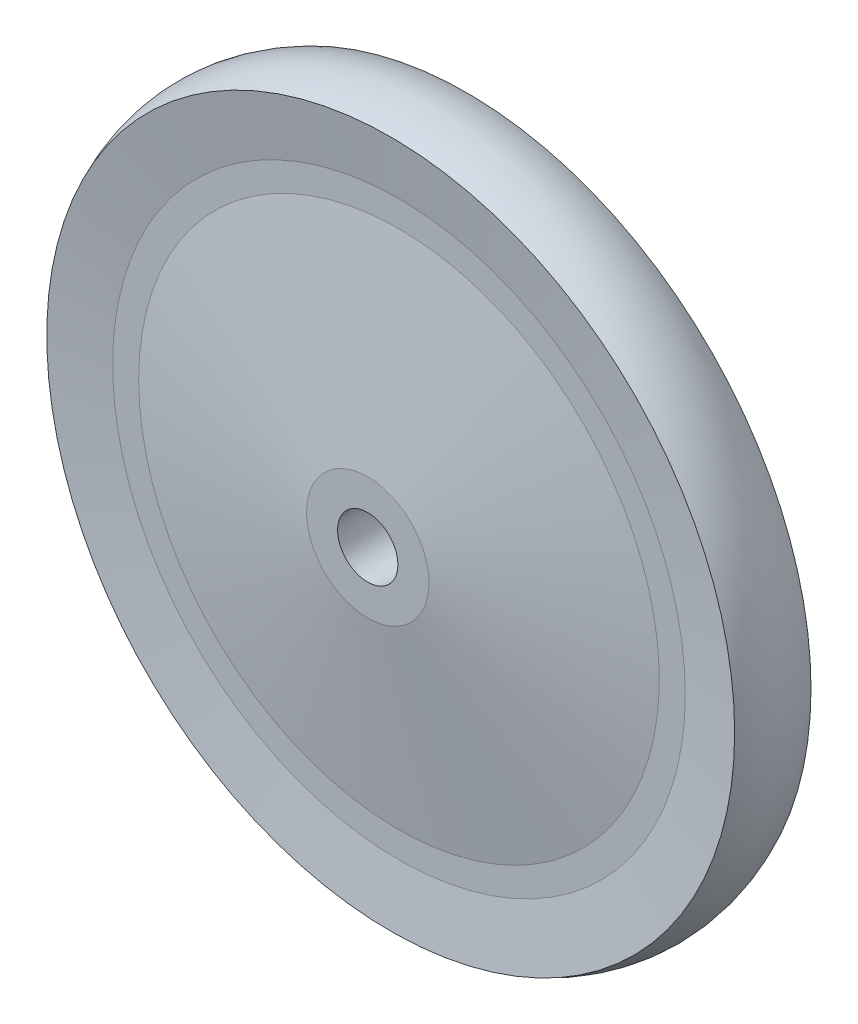
ISO-10303-21;
HEADER;
FILE_DESCRIPTION(('STEP AP214'),'2;1');
FILE_NAME('part.step','',(''),(''),'','','');
FILE_SCHEMA(('AUTOMOTIVE_DESIGN { 1 0 10303 214 1 1 1 1 }'));
ENDSEC;
DATA;
#1=APPLICATION_CONTEXT('core data for automotive mechanical design processes');
#2=APPLICATION_PROTOCOL_DEFINITION('international standard','automotive_design',2000,#1);
#3=PRODUCT_CONTEXT('',#1,'mechanical');
#4=PRODUCT('Part','Part','',(#3));
#5=PRODUCT_RELATED_PRODUCT_CATEGORY('part','',(#4));
#6=PRODUCT_DEFINITION_FORMATION('','',#4);
#7=PRODUCT_DEFINITION_CONTEXT('part definition',#1,'design');
#8=PRODUCT_DEFINITION('design','',#6,#7);
#9=PRODUCT_DEFINITION_SHAPE('','',#8);
#10=(LENGTH_UNIT() NAMED_UNIT(*) SI_UNIT(.MILLI.,.METRE.));
#11=(NAMED_UNIT(*) PLANE_ANGLE_UNIT() SI_UNIT($,.RADIAN.));
#12=(NAMED_UNIT(*) SI_UNIT($,.STERADIAN.) SOLID_ANGLE_UNIT());
#13=UNCERTAINTY_MEASURE_WITH_UNIT(LENGTH_MEASURE(1.E-05),#10,'distance_accuracy_value','');
#14=(GEOMETRIC_REPRESENTATION_CONTEXT(3) GLOBAL_UNCERTAINTY_ASSIGNED_CONTEXT((#13)) GLOBAL_UNIT_ASSIGNED_CONTEXT((#10,
#11,#12)) REPRESENTATION_CONTEXT('',''));
#15=CARTESIAN_POINT('',(0.,0.,0.));
#16=DIRECTION('',(0.,0.,1.));
#17=DIRECTION('',(1.,0.,0.));
#18=AXIS2_PLACEMENT_3D('',#15,#16,#17);
#19=CARTESIAN_POINT('',(0.,35.25,-35.25));
#20=DIRECTION('',(0.,0.,1.));
#21=DIRECTION('',(1.,0.,0.));
#22=AXIS2_PLACEMENT_3D('',#19,#20,#21);
#23=PLANE('',#22);
#24=CARTESIAN_POINT('',(0.,0.,-35.25));
#25=DIRECTION('',(0.,0.,1.));
#26=DIRECTION('',(1.,0.,0.));
#27=AXIS2_PLACEMENT_3D('',#24,#25,#26);
#28=CIRCLE('',#27,35.25);
#29=CARTESIAN_POINT('',(35.25,0.,-35.25));
#30=VERTEX_POINT('',#29);
#31=EDGE_CURVE('E10',#30,#30,#28,.T.);
#32=ORIENTED_EDGE('',*,*,#31,.F.);
#33=EDGE_LOOP('',(#32));
#34=FACE_BOUND('',#33,.T.);
#35=CARTESIAN_POINT('',(0.,0.,-35.25));
#36=DIRECTION('',(0.,0.,1.));
#37=DIRECTION('',(1.,0.,0.));
#38=AXIS2_PLACEMENT_3D('',#35,#36,#37);
#39=CIRCLE('',#38,17.375);
#40=CARTESIAN_POINT('',(17.375,0.,-35.25));
#41=VERTEX_POINT('',#40);
#42=EDGE_CURVE('E68',#41,#41,#39,.T.);
#43=ORIENTED_EDGE('',*,*,#42,.T.);
#44=EDGE_LOOP('',(#43));
#45=FACE_BOUND('',#44,.T.);
#46=ADVANCED_FACE('F34',(#34,#45),#23,.F.);
#47=CARTESIAN_POINT('',(0.,0.,-35.25));
#48=DIRECTION('',(0.,0.,1.));
#49=DIRECTION('',(1.,0.,0.));
#50=AXIS2_PLACEMENT_3D('',#47,#48,#49);
#51=CONICAL_SURFACE('',#50,35.25,1.41520149881787);
#52=CARTESIAN_POINT('',(0.,0.,-17.25));
#53=DIRECTION('',(0.,0.,1.));
#54=DIRECTION('',(1.,0.,0.));
#55=AXIS2_PLACEMENT_3D('',#52,#53,#54);
#56=CIRCLE('',#55,150.);
#57=CARTESIAN_POINT('',(150.,0.,-17.25));
#58=VERTEX_POINT('',#57);
#59=EDGE_CURVE('E40',#58,#58,#56,.T.);
#60=CARTESIAN_POINT('',(150.,0.,-17.25));
#61=CARTESIAN_POINT('',(148.8046875,0.,-17.4375));
#62=CARTESIAN_POINT('',(147.609375,0.,-17.625));
#63=CARTESIAN_POINT('',(145.21875,0.,-18.));
#64=CARTESIAN_POINT('',(144.0234375,0.,-18.1875));
#65=CARTESIAN_POINT('',(141.6328125,0.,-18.5625));
#66=CARTESIAN_POINT('',(140.4375,0.,-18.75));
#67=CARTESIAN_POINT('',(138.046875,0.,-19.125));
#68=CARTESIAN_POINT('',(136.8515625,0.,-19.3125));
#69=CARTESIAN_POINT('',(134.4609375,0.,-19.6875));
#70=CARTESIAN_POINT('',(133.265625,0.,-19.875));
#71=CARTESIAN_POINT('',(130.875,0.,-20.25));
#72=CARTESIAN_POINT('',(129.6796875,0.,-20.4375));
#73=CARTESIAN_POINT('',(127.2890625,0.,-20.8125));
#74=CARTESIAN_POINT('',(126.09375,0.,-21.));
#75=CARTESIAN_POINT('',(123.703125,0.,-21.375));
#76=CARTESIAN_POINT('',(122.5078125,0.,-21.5625));
#77=CARTESIAN_POINT('',(120.1171875,0.,-21.9375));
#78=CARTESIAN_POINT('',(118.921875,0.,-22.125));
#79=CARTESIAN_POINT('',(116.53125,0.,-22.5));
#80=CARTESIAN_POINT('',(115.3359375,0.,-22.6875));
#81=CARTESIAN_POINT('',(112.9453125,0.,-23.0625));
#82=CARTESIAN_POINT('',(111.75,0.,-23.25));
#83=CARTESIAN_POINT('',(109.359375,0.,-23.625));
#84=CARTESIAN_POINT('',(108.1640625,0.,-23.8125));
#85=CARTESIAN_POINT('',(105.7734375,0.,-24.1875));
#86=CARTESIAN_POINT('',(104.578125,0.,-24.375));
#87=CARTESIAN_POINT('',(102.1875,0.,-24.75));
#88=CARTESIAN_POINT('',(100.9921875,0.,-24.9375));
#89=CARTESIAN_POINT('',(98.6015625,0.,-25.3125));
#90=CARTESIAN_POINT('',(97.40625,0.,-25.5));
#91=CARTESIAN_POINT('',(95.015625,0.,-25.875));
#92=CARTESIAN_POINT('',(93.8203125,0.,-26.0625));
#93=CARTESIAN_POINT('',(91.4296875,0.,-26.4375));
#94=CARTESIAN_POINT('',(90.234375,0.,-26.625));
#95=CARTESIAN_POINT('',(87.84375,0.,-27.));
#96=CARTESIAN_POINT('',(86.6484375,0.,-27.1875));
#97=CARTESIAN_POINT('',(84.2578125,0.,-27.5625));
#98=CARTESIAN_POINT('',(83.0625,0.,-27.75));
#99=CARTESIAN_POINT('',(80.671875,0.,-28.125));
#100=CARTESIAN_POINT('',(79.4765625,0.,-28.3125));
#101=CARTESIAN_POINT('',(77.0859375,0.,-28.6875));
#102=CARTESIAN_POINT('',(75.890625,0.,-28.875));
#103=CARTESIAN_POINT('',(73.5,0.,-29.25));
#104=CARTESIAN_POINT('',(72.3046875,0.,-29.4375));
#105=CARTESIAN_POINT('',(69.9140625,0.,-29.8125));
#106=CARTESIAN_POINT('',(68.71875,0.,-30.));
#107=CARTESIAN_POINT('',(66.328125,0.,-30.375));
#108=CARTESIAN_POINT('',(65.1328125,0.,-30.5625));
#109=CARTESIAN_POINT('',(62.7421875,0.,-30.9375));
#110=CARTESIAN_POINT('',(61.546875,0.,-31.125));
#111=CARTESIAN_POINT('',(59.15625,0.,-31.5));
#112=CARTESIAN_POINT('',(57.9609375,0.,-31.6875));
#113=CARTESIAN_POINT('',(55.5703125,0.,-32.0625));
#114=CARTESIAN_POINT('',(54.375,0.,-32.25));
#115=CARTESIAN_POINT('',(51.984375,0.,-32.625));
#116=CARTESIAN_POINT('',(50.7890625,0.,-32.8125));
#117=CARTESIAN_POINT('',(48.3984375,0.,-33.1875));
#118=CARTESIAN_POINT('',(47.203125,0.,-33.375));
#119=CARTESIAN_POINT('',(44.8125,0.,-33.75));
#120=CARTESIAN_POINT('',(43.6171875,0.,-33.9375));
#121=CARTESIAN_POINT('',(41.2265625,0.,-34.3125));
#122=CARTESIAN_POINT('',(40.03125,0.,-34.5));
#123=CARTESIAN_POINT('',(37.640625,0.,-34.875));
#124=CARTESIAN_POINT('',(36.4453125,0.,-35.0625));
#125=CARTESIAN_POINT('',(35.25,0.,-35.25));
#126=B_SPLINE_CURVE_WITH_KNOTS('',3,(#60,#61,#62,#63,#64,#65,#66,#67,#68,#69,#70,#71,#72,#73,
#74,#75,#76,#77,#78,#79,#80,#81,#82,#83,#84,#85,#86,#87,#88,#89,#90,#91,#92,#93,#94,#95,#96,#97,
#98,#99,#100,#101,#102,#103,#104,#105,#106,#107,#108,#109,#110,#111,#112,#113,#114,#115,#116,
#117,#118,#119,#120,#121,#122,#123,#124,#125),.UNSPECIFIED.,.F.,.F.,(4,2,2,2,2,2,2,2,2,2,2,2,2,
2,2,2,2,2,2,2,2,2,2,2,2,2,2,2,2,2,2,2,4),(0.,3.62978704663321,7.25957409326644,10.8893611398997,
14.5191481865329,18.148935233166,21.7787222797993,25.4085093264325,29.0382963730657,
32.6680834196989,36.2978704663321,39.9276575129653,43.5574445595985,47.1872316062318,
50.817018652865,54.4468056994982,58.0765927461314,61.7063797927646,65.3361668393978,
68.965953886031,72.5957409326642,76.2255279792975,79.8553150259307,83.4851020725639,
87.1148891191971,90.7446761658303,94.3744632124635,98.0042502590967,101.63403730573,
105.263824352363,108.893611398996,112.52339844563,116.153185492263),.UNSPECIFIED.);
#127=EDGE_CURVE('BSEAM117',#58,#30,#126,.T.);
#128=ORIENTED_EDGE('',*,*,#59,.F.);
#129=ORIENTED_EDGE('',*,*,#31,.T.);
#130=ORIENTED_EDGE('',*,*,#127,.T.);
#131=ORIENTED_EDGE('',*,*,#127,.F.);
#132=EDGE_LOOP('',(#128,#130,#129,#131));
#133=FACE_BOUND('',#132,.T.);
#134=ADVANCED_FACE('F117',(#133),#51,.T.);
#135=CARTESIAN_POINT('',(0.,150.,-17.25));
#136=DIRECTION('',(0.,0.,1.));
#137=DIRECTION('',(1.,0.,0.));
#138=AXIS2_PLACEMENT_3D('',#135,#136,#137);
#139=PLANE('',#138);
#140=CARTESIAN_POINT('',(0.,0.,-17.25));
#141=DIRECTION('',(0.,0.,1.));
#142=DIRECTION('',(1.,0.,0.));
#143=AXIS2_PLACEMENT_3D('',#140,#141,#142);
#144=CIRCLE('',#143,165.);
#145=CARTESIAN_POINT('',(165.,0.,-17.25));
#146=VERTEX_POINT('',#145);
#147=EDGE_CURVE('E44',#146,#146,#144,.T.);
#148=ORIENTED_EDGE('',*,*,#147,.F.);
#149=EDGE_LOOP('',(#148));
#150=FACE_BOUND('',#149,.T.);
#151=ORIENTED_EDGE('',*,*,#59,.T.);
#152=EDGE_LOOP('',(#151));
#153=FACE_BOUND('',#152,.T.);
#154=ADVANCED_FACE('F112',(#150,#153),#139,.F.);
#155=CARTESIAN_POINT('',(0.,0.,-17.25));
#156=DIRECTION('',(0.,0.,-1.));
#157=DIRECTION('',(-1.,0.,0.));
#158=AXIS2_PLACEMENT_3D('',#155,#156,#157);
#159=CONICAL_SURFACE('',#158,165.,1.42868843517088);
#160=CARTESIAN_POINT('',(0.,0.,-22.));
#161=DIRECTION('',(0.,0.,1.));
#162=DIRECTION('',(1.,0.,0.));
#163=AXIS2_PLACEMENT_3D('',#160,#161,#162);
#164=CIRCLE('',#163,198.2);
#165=CARTESIAN_POINT('',(198.2,0.,-22.));
#166=VERTEX_POINT('',#165);
#167=EDGE_CURVE('E48',#166,#166,#164,.T.);
#168=ORIENTED_EDGE('',*,*,#167,.F.);
#169=EDGE_LOOP('',(#168));
#170=FACE_BOUND('',#169,.T.);
#171=ORIENTED_EDGE('',*,*,#147,.T.);
#172=EDGE_LOOP('',(#171));
#173=FACE_BOUND('',#172,.T.);
#174=ADVANCED_FACE('F106',(#170,#173),#159,.F.);
#175=CARTESIAN_POINT('',(0.,0.,0.));
#176=DIRECTION('',(0.,0.,1.));
#177=DIRECTION('',(1.,0.,0.));
#178=AXIS2_PLACEMENT_3D('',#175,#176,#177);
#179=TOROIDAL_SURFACE('',#178,152.3,50.8999999999999);
#180=CARTESIAN_POINT('',(0.,0.,22.));
#181=DIRECTION('',(0.,0.,1.));
#182=DIRECTION('',(1.,0.,0.));
#183=AXIS2_PLACEMENT_3D('',#180,#181,#182);
#184=CIRCLE('',#183,198.2);
#185=CARTESIAN_POINT('',(198.2,0.,22.));
#186=VERTEX_POINT('',#185);
#187=EDGE_CURVE('E53',#186,#186,#184,.T.);
#188=ORIENTED_EDGE('',*,*,#187,.F.);
#189=EDGE_LOOP('',(#188));
#190=FACE_BOUND('',#189,.T.);
#191=ORIENTED_EDGE('',*,*,#167,.T.);
#192=EDGE_LOOP('',(#191));
#193=FACE_BOUND('',#192,.T.);
#194=ADVANCED_FACE('F100',(#190,#193),#179,.T.);
#195=CARTESIAN_POINT('',(0.,0.,22.));
#196=DIRECTION('',(0.,0.,1.));
#197=DIRECTION('',(1.,0.,0.));
#198=AXIS2_PLACEMENT_3D('',#195,#196,#197);
#199=CONICAL_SURFACE('',#198,198.2,1.42868843517088);
#200=CARTESIAN_POINT('',(0.,0.,17.25));
#201=DIRECTION('',(0.,0.,1.));
#202=DIRECTION('',(1.,0.,0.));
#203=AXIS2_PLACEMENT_3D('',#200,#201,#202);
#204=CIRCLE('',#203,165.);
#205=CARTESIAN_POINT('',(165.,0.,17.25));
#206=VERTEX_POINT('',#205);
#207=EDGE_CURVE('E56',#206,#206,#204,.T.);
#208=ORIENTED_EDGE('',*,*,#207,.F.);
#209=EDGE_LOOP('',(#208));
#210=FACE_BOUND('',#209,.T.);
#211=ORIENTED_EDGE('',*,*,#187,.T.);
#212=EDGE_LOOP('',(#211));
#213=FACE_BOUND('',#212,.T.);
#214=ADVANCED_FACE('F94',(#210,#213),#199,.F.);
#215=CARTESIAN_POINT('',(0.,150.,17.25));
#216=DIRECTION('',(0.,0.,-1.));
#217=DIRECTION('',(-1.,0.,0.));
#218=AXIS2_PLACEMENT_3D('',#215,#216,#217);
#219=PLANE('',#218);
#220=CARTESIAN_POINT('',(0.,0.,17.25));
#221=DIRECTION('',(0.,0.,1.));
#222=DIRECTION('',(1.,0.,0.));
#223=AXIS2_PLACEMENT_3D('',#220,#221,#222);
#224=CIRCLE('',#223,150.);
#225=CARTESIAN_POINT('',(-150.,0.,17.25));
#226=VERTEX_POINT('',#225);
#227=EDGE_CURVE('E59',#226,#226,#224,.T.);
#228=ORIENTED_EDGE('',*,*,#227,.F.);
#229=EDGE_LOOP('',(#228));
#230=FACE_BOUND('',#229,.T.);
#231=ORIENTED_EDGE('',*,*,#207,.T.);
#232=EDGE_LOOP('',(#231));
#233=FACE_BOUND('',#232,.T.);
#234=ADVANCED_FACE('F88',(#230,#233),#219,.F.);
#235=CARTESIAN_POINT('',(0.,0.,17.25));
#236=DIRECTION('',(0.,0.,-1.));
#237=DIRECTION('',(-1.,0.,0.));
#238=AXIS2_PLACEMENT_3D('',#235,#236,#237);
#239=CONICAL_SURFACE('',#238,150.,1.41520149881787);
#240=CARTESIAN_POINT('',(0.,0.,35.25));
#241=DIRECTION('',(0.,0.,1.));
#242=DIRECTION('',(1.,0.,0.));
#243=AXIS2_PLACEMENT_3D('',#240,#241,#242);
#244=CIRCLE('',#243,35.25);
#245=CARTESIAN_POINT('',(-35.25,0.,35.25));
#246=VERTEX_POINT('',#245);
#247=EDGE_CURVE('E62',#246,#246,#244,.T.);
#248=CARTESIAN_POINT('',(-35.25,0.,35.25));
#249=CARTESIAN_POINT('',(-36.4453125,0.,35.0625));
#250=CARTESIAN_POINT('',(-37.640625,0.,34.875));
#251=CARTESIAN_POINT('',(-40.03125,0.,34.5));
#252=CARTESIAN_POINT('',(-41.2265625,0.,34.3125));
#253=CARTESIAN_POINT('',(-43.6171875,0.,33.9375));
#254=CARTESIAN_POINT('',(-44.8125,0.,33.75));
#255=CARTESIAN_POINT('',(-47.203125,0.,33.375));
#256=CARTESIAN_POINT('',(-48.3984375,0.,33.1875));
#257=CARTESIAN_POINT('',(-50.7890625,0.,32.8125));
#258=CARTESIAN_POINT('',(-51.984375,0.,32.625));
#259=CARTESIAN_POINT('',(-54.375,0.,32.25));
#260=CARTESIAN_POINT('',(-55.5703125,0.,32.0625));
#261=CARTESIAN_POINT('',(-57.9609375,0.,31.6875));
#262=CARTESIAN_POINT('',(-59.15625,0.,31.5));
#263=CARTESIAN_POINT('',(-61.546875,0.,31.125));
#264=CARTESIAN_POINT('',(-62.7421875,0.,30.9375));
#265=CARTESIAN_POINT('',(-65.1328125,0.,30.5625));
#266=CARTESIAN_POINT('',(-66.328125,0.,30.375));
#267=CARTESIAN_POINT('',(-68.71875,0.,30.));
#268=CARTESIAN_POINT('',(-69.9140625,0.,29.8125));
#269=CARTESIAN_POINT('',(-72.3046875,0.,29.4375));
#270=CARTESIAN_POINT('',(-73.5,0.,29.25));
#271=CARTESIAN_POINT('',(-75.890625,0.,28.875));
#272=CARTESIAN_POINT('',(-77.0859375,0.,28.6875));
#273=CARTESIAN_POINT('',(-79.4765625,0.,28.3125));
#274=CARTESIAN_POINT('',(-80.671875,0.,28.125));
#275=CARTESIAN_POINT('',(-83.0625,0.,27.75));
#276=CARTESIAN_POINT('',(-84.2578125,0.,27.5625));
#277=CARTESIAN_POINT('',(-86.6484375,0.,27.1875));
#278=CARTESIAN_POINT('',(-87.84375,0.,27.));
#279=CARTESIAN_POINT('',(-90.234375,0.,26.625));
#280=CARTESIAN_POINT('',(-91.4296875,0.,26.4375));
#281=CARTESIAN_POINT('',(-93.8203125,0.,26.0625));
#282=CARTESIAN_POINT('',(-95.015625,0.,25.875));
#283=CARTESIAN_POINT('',(-97.40625,0.,25.5));
#284=CARTESIAN_POINT('',(-98.6015625,0.,25.3125));
#285=CARTESIAN_POINT('',(-100.9921875,0.,24.9375));
#286=CARTESIAN_POINT('',(-102.1875,0.,24.75));
#287=CARTESIAN_POINT('',(-104.578125,0.,24.375));
#288=CARTESIAN_POINT('',(-105.7734375,0.,24.1875));
#289=CARTESIAN_POINT('',(-108.1640625,0.,23.8125));
#290=CARTESIAN_POINT('',(-109.359375,0.,23.625));
#291=CARTESIAN_POINT('',(-111.75,0.,23.25));
#292=CARTESIAN_POINT('',(-112.9453125,0.,23.0625));
#293=CARTESIAN_POINT('',(-115.3359375,0.,22.6875));
#294=CARTESIAN_POINT('',(-116.53125,0.,22.5));
#295=CARTESIAN_POINT('',(-118.921875,0.,22.125));
#296=CARTESIAN_POINT('',(-120.1171875,0.,21.9375));
#297=CARTESIAN_POINT('',(-122.5078125,0.,21.5625));
#298=CARTESIAN_POINT('',(-123.703125,0.,21.375));
#299=CARTESIAN_POINT('',(-126.09375,0.,21.));
#300=CARTESIAN_POINT('',(-127.2890625,0.,20.8125));
#301=CARTESIAN_POINT('',(-129.6796875,0.,20.4375));
#302=CARTESIAN_POINT('',(-130.875,0.,20.25));
#303=CARTESIAN_POINT('',(-133.265625,0.,19.875));
#304=CARTESIAN_POINT('',(-134.4609375,0.,19.6875));
#305=CARTESIAN_POINT('',(-136.8515625,0.,19.3125));
#306=CARTESIAN_POINT('',(-138.046875,0.,19.125));
#307=CARTESIAN_POINT('',(-140.4375,0.,18.75));
#308=CARTESIAN_POINT('',(-141.6328125,0.,18.5625));
#309=CARTESIAN_POINT('',(-144.0234375,0.,18.1875));
#310=CARTESIAN_POINT('',(-145.21875,0.,18.));
#311=CARTESIAN_POINT('',(-147.609375,0.,17.625));
#312=CARTESIAN_POINT('',(-148.8046875,0.,17.4375));
#313=CARTESIAN_POINT('',(-150.,0.,17.25));
#314=B_SPLINE_CURVE_WITH_KNOTS('',3,(#248,#249,#250,#251,#252,#253,#254,#255,#256,#257,#258,
#259,#260,#261,#262,#263,#264,#265,#266,#267,#268,#269,#270,#271,#272,#273,#274,#275,#276,#277,
#278,#279,#280,#281,#282,#283,#284,#285,#286,#287,#288,#289,#290,#291,#292,#293,#294,#295,#296,
#297,#298,#299,#300,#301,#302,#303,#304,#305,#306,#307,#308,#309,#310,#311,#312,#313),
.UNSPECIFIED.,.F.,.F.,(4,2,2,2,2,2,2,2,2,2,2,2,2,2,2,2,2,2,2,2,2,2,2,2,2,2,2,2,2,2,2,2,4),(0.,
3.62978704663322,7.25957409326643,10.8893611398996,14.5191481865328,18.1489352331661,
21.7787222797993,25.4085093264325,29.0382963730657,32.6680834196989,36.2978704663321,
39.9276575129653,43.5574445595985,47.1872316062317,50.8170186528649,54.4468056994982,
58.0765927461314,61.7063797927646,65.3361668393978,68.965953886031,72.5957409326642,
76.2255279792974,79.8553150259306,83.4851020725638,87.114889119197,90.7446761658303,
94.3744632124635,98.0042502590967,101.63403730573,105.263824352363,108.893611398996,
112.52339844563,116.153185492263),.UNSPECIFIED.);
#315=EDGE_CURVE('BSEAM82',#246,#226,#314,.T.);
#316=ORIENTED_EDGE('',*,*,#247,.F.);
#317=ORIENTED_EDGE('',*,*,#227,.T.);
#318=ORIENTED_EDGE('',*,*,#315,.T.);
#319=ORIENTED_EDGE('',*,*,#315,.F.);
#320=EDGE_LOOP('',(#316,#318,#317,#319));
#321=FACE_BOUND('',#320,.T.);
#322=ADVANCED_FACE('F82',(#321),#239,.T.);
#323=CARTESIAN_POINT('',(0.,35.25,35.25));
#324=DIRECTION('',(0.,0.,-1.));
#325=DIRECTION('',(-1.,0.,0.));
#326=AXIS2_PLACEMENT_3D('',#323,#324,#325);
#327=PLANE('',#326);
#328=CARTESIAN_POINT('',(0.,0.,35.25));
#329=DIRECTION('',(0.,0.,1.));
#330=DIRECTION('',(1.,0.,0.));
#331=AXIS2_PLACEMENT_3D('',#328,#329,#330);
#332=CIRCLE('',#331,17.375);
#333=CARTESIAN_POINT('',(17.375,0.,35.25));
#334=VERTEX_POINT('',#333);
#335=EDGE_CURVE('E65',#334,#334,#332,.T.);
#336=ORIENTED_EDGE('',*,*,#335,.F.);
#337=EDGE_LOOP('',(#336));
#338=FACE_BOUND('',#337,.T.);
#339=ORIENTED_EDGE('',*,*,#247,.T.);
#340=EDGE_LOOP('',(#339));
#341=FACE_BOUND('',#340,.T.);
#342=ADVANCED_FACE('F76',(#338,#341),#327,.F.);
#343=CARTESIAN_POINT('',(0.,0.,0.));
#344=DIRECTION('',(0.,0.,1.));
#345=DIRECTION('',(1.,0.,0.));
#346=AXIS2_PLACEMENT_3D('',#343,#344,#345);
#347=CYLINDRICAL_SURFACE('',#346,17.375);
#348=ORIENTED_EDGE('',*,*,#42,.F.);
#349=EDGE_LOOP('',(#348));
#350=FACE_BOUND('',#349,.T.);
#351=ORIENTED_EDGE('',*,*,#335,.T.);
#352=EDGE_LOOP('',(#351));
#353=FACE_BOUND('',#352,.T.);
#354=ADVANCED_FACE('F73',(#350,#353),#347,.F.);
#355=CLOSED_SHELL('',(#46,#134,#154,#174,#194,#214,#234,#322,#342,#354));
#356=MANIFOLD_SOLID_BREP('B2',#355);
#357=ADVANCED_BREP_SHAPE_REPRESENTATION('',(#18,#356),#14);
#358=SHAPE_DEFINITION_REPRESENTATION(#9,#357);
ENDSEC;
END-ISO-10303-21;
